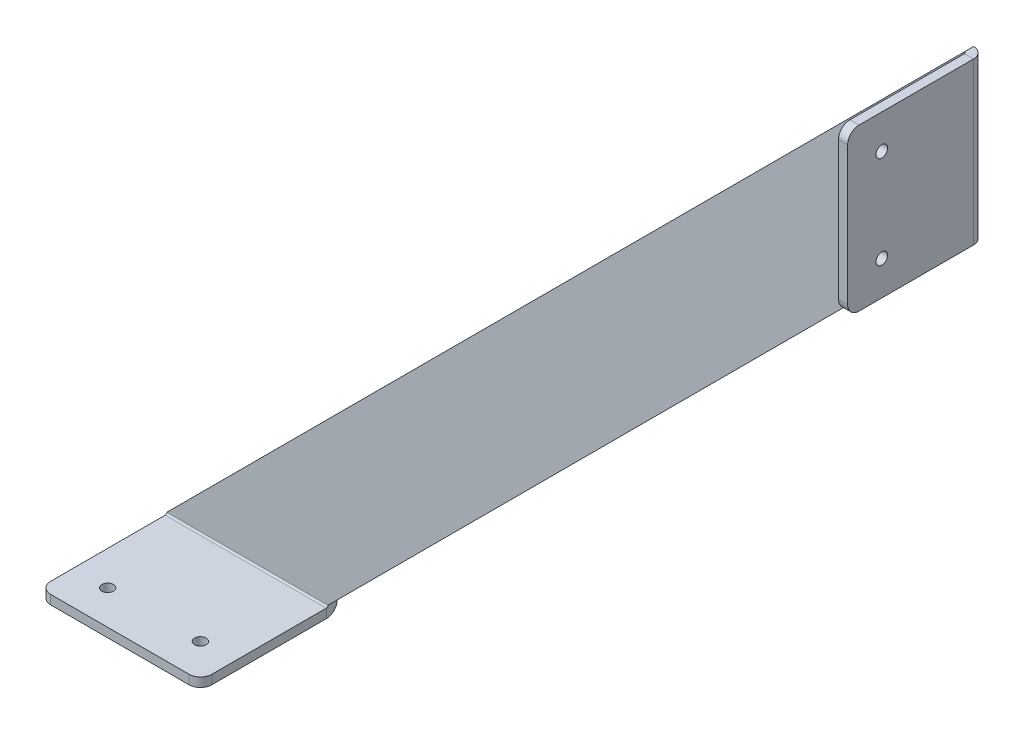
ISO-10303-21;
HEADER;
FILE_DESCRIPTION(('STEP AP214'),'2;1');
FILE_NAME('part.step','',(''),(''),'','','');
FILE_SCHEMA(('AUTOMOTIVE_DESIGN { 1 0 10303 214 1 1 1 1 }'));
ENDSEC;
DATA;
#1=APPLICATION_CONTEXT('core data for automotive mechanical design processes');
#2=APPLICATION_PROTOCOL_DEFINITION('international standard','automotive_design',2000,#1);
#3=PRODUCT_CONTEXT('',#1,'mechanical');
#4=PRODUCT('Part','Part','',(#3));
#5=PRODUCT_RELATED_PRODUCT_CATEGORY('part','',(#4));
#6=PRODUCT_DEFINITION_FORMATION('','',#4);
#7=PRODUCT_DEFINITION_CONTEXT('part definition',#1,'design');
#8=PRODUCT_DEFINITION('design','',#6,#7);
#9=PRODUCT_DEFINITION_SHAPE('','',#8);
#10=(LENGTH_UNIT() NAMED_UNIT(*) SI_UNIT(.MILLI.,.METRE.));
#11=(NAMED_UNIT(*) PLANE_ANGLE_UNIT() SI_UNIT($,.RADIAN.));
#12=(NAMED_UNIT(*) SI_UNIT($,.STERADIAN.) SOLID_ANGLE_UNIT());
#13=UNCERTAINTY_MEASURE_WITH_UNIT(LENGTH_MEASURE(1.E-05),#10,'distance_accuracy_value','');
#14=(GEOMETRIC_REPRESENTATION_CONTEXT(3) GLOBAL_UNCERTAINTY_ASSIGNED_CONTEXT((#13)) GLOBAL_UNIT_ASSIGNED_CONTEXT((#10,
#11,#12)) REPRESENTATION_CONTEXT('',''));
#15=CARTESIAN_POINT('',(0.,0.,0.));
#16=DIRECTION('',(0.,0.,1.));
#17=DIRECTION('',(1.,0.,0.));
#18=AXIS2_PLACEMENT_3D('',#15,#16,#17);
#19=CARTESIAN_POINT('',(-104.289321881345,-175.,-4.));
#20=DIRECTION('',(0.707106781186548,-0.707106781186547,0.));
#21=DIRECTION('',(0.707106781186547,0.707106781186548,0.));
#22=AXIS2_PLACEMENT_3D('',#19,#20,#21);
#23=PLANE('',#22);
#24=DIRECTION('',(0.707106781186547,0.707106781186548,0.));
#25=VECTOR('',#24,1.);
#26=CARTESIAN_POINT('',(-104.289321881345,-175.,0.));
#27=LINE('',#26,#25);
#28=CARTESIAN_POINT('',(-104.289321881345,-175.,0.));
#29=VERTEX_POINT('',#28);
#30=CARTESIAN_POINT('',(175.,104.289321881345,0.));
#31=VERTEX_POINT('',#30);
#32=EDGE_CURVE('E288',#29,#31,#27,.T.);
#33=ORIENTED_EDGE('',*,*,#32,.F.);
#34=DIRECTION('',(0.,0.,1.));
#35=VECTOR('',#34,1.);
#36=CARTESIAN_POINT('',(-104.289321881345,-175.,-4.));
#37=LINE('',#36,#35);
#38=CARTESIAN_POINT('',(-104.289321881345,-175.,-4.));
#39=VERTEX_POINT('',#38);
#40=EDGE_CURVE('E308',#39,#29,#37,.T.);
#41=ORIENTED_EDGE('',*,*,#40,.F.);
#42=DIRECTION('',(0.707106781186547,0.707106781186548,0.));
#43=VECTOR('',#42,1.);
#44=CARTESIAN_POINT('',(-104.289321881345,-175.,-4.));
#45=LINE('',#44,#43);
#46=CARTESIAN_POINT('',(175.,104.289321881345,-4.));
#47=VERTEX_POINT('',#46);
#48=EDGE_CURVE('E292',#39,#47,#45,.T.);
#49=ORIENTED_EDGE('',*,*,#48,.T.);
#50=DIRECTION('',(0.,0.,1.));
#51=VECTOR('',#50,1.);
#52=CARTESIAN_POINT('',(175.,104.289321881345,-4.));
#53=LINE('',#52,#51);
#54=EDGE_CURVE('E305',#47,#31,#53,.T.);
#55=ORIENTED_EDGE('',*,*,#54,.T.);
#56=EDGE_LOOP('',(#33,#41,#49,#55));
#57=FACE_BOUND('',#56,.T.);
#58=ADVANCED_FACE('F77',(#57),#23,.T.);
#59=CARTESIAN_POINT('',(175.,175.,-4.));
#60=DIRECTION('',(-0.707106781186547,0.707106781186547,0.));
#61=DIRECTION('',(-0.707106781186548,-0.707106781186548,0.));
#62=AXIS2_PLACEMENT_3D('',#59,#60,#61);
#63=PLANE('',#62);
#64=DIRECTION('',(-0.707106781186548,-0.707106781186548,0.));
#65=VECTOR('',#64,1.);
#66=CARTESIAN_POINT('',(175.,175.,0.));
#67=LINE('',#66,#65);
#68=CARTESIAN_POINT('',(175.,175.,0.));
#69=VERTEX_POINT('',#68);
#70=CARTESIAN_POINT('',(-175.,-175.,0.));
#71=VERTEX_POINT('',#70);
#72=EDGE_CURVE('E298',#69,#71,#67,.T.);
#73=ORIENTED_EDGE('',*,*,#72,.F.);
#74=DIRECTION('',(0.,0.,1.));
#75=VECTOR('',#74,1.);
#76=CARTESIAN_POINT('',(175.,175.,-4.));
#77=LINE('',#76,#75);
#78=CARTESIAN_POINT('',(175.,175.,-4.));
#79=VERTEX_POINT('',#78);
#80=EDGE_CURVE('E295',#79,#69,#77,.T.);
#81=ORIENTED_EDGE('',*,*,#80,.F.);
#82=DIRECTION('',(-0.707106781186548,-0.707106781186548,0.));
#83=VECTOR('',#82,1.);
#84=CARTESIAN_POINT('',(175.,175.,-4.));
#85=LINE('',#84,#83);
#86=CARTESIAN_POINT('',(-175.,-175.,-4.));
#87=VERTEX_POINT('',#86);
#88=EDGE_CURVE('E287',#79,#87,#85,.T.);
#89=ORIENTED_EDGE('',*,*,#88,.T.);
#90=DIRECTION('',(0.,0.,1.));
#91=VECTOR('',#90,1.);
#92=CARTESIAN_POINT('',(-175.,-175.,-4.));
#93=LINE('',#92,#91);
#94=EDGE_CURVE('E310',#87,#71,#93,.T.);
#95=ORIENTED_EDGE('',*,*,#94,.T.);
#96=EDGE_LOOP('',(#73,#81,#89,#95));
#97=FACE_BOUND('',#96,.T.);
#98=ADVANCED_FACE('F366',(#97),#63,.T.);
#99=CARTESIAN_POINT('',(0.,0.,-4.));
#100=DIRECTION('',(0.,0.,-1.));
#101=DIRECTION('',(-1.,0.,0.));
#102=AXIS2_PLACEMENT_3D('',#99,#100,#101);
#103=PLANE('',#102);
#104=DIRECTION('',(0.,1.,0.));
#105=VECTOR('',#104,1.);
#106=CARTESIAN_POINT('',(175.,104.289321881345,-4.));
#107=LINE('',#106,#105);
#108=EDGE_CURVE('E284',#47,#79,#107,.T.);
#109=ORIENTED_EDGE('',*,*,#108,.F.);
#110=ORIENTED_EDGE('',*,*,#48,.F.);
#111=DIRECTION('',(1.,0.,0.));
#112=VECTOR('',#111,1.);
#113=CARTESIAN_POINT('',(-175.,-175.,-4.));
#114=LINE('',#113,#112);
#115=EDGE_CURVE('E201',#87,#39,#114,.T.);
#116=ORIENTED_EDGE('',*,*,#115,.F.);
#117=ORIENTED_EDGE('',*,*,#88,.F.);
#118=EDGE_LOOP('',(#109,#110,#116,#117));
#119=FACE_BOUND('',#118,.T.);
#120=ADVANCED_FACE('F415',(#119),#103,.T.);
#121=CARTESIAN_POINT('',(0.,0.,0.));
#122=DIRECTION('',(0.,0.,-1.));
#123=DIRECTION('',(-1.,0.,0.));
#124=AXIS2_PLACEMENT_3D('',#121,#122,#123);
#125=PLANE('',#124);
#126=DIRECTION('',(0.,1.,0.));
#127=VECTOR('',#126,1.);
#128=CARTESIAN_POINT('',(175.,104.289321881345,0.));
#129=LINE('',#128,#127);
#130=EDGE_CURVE('E275',#31,#69,#129,.T.);
#131=ORIENTED_EDGE('',*,*,#130,.T.);
#132=ORIENTED_EDGE('',*,*,#72,.T.);
#133=DIRECTION('',(1.,0.,0.));
#134=VECTOR('',#133,1.);
#135=CARTESIAN_POINT('',(-175.,-175.,0.));
#136=LINE('',#135,#134);
#137=EDGE_CURVE('E301',#71,#29,#136,.T.);
#138=ORIENTED_EDGE('',*,*,#137,.T.);
#139=ORIENTED_EDGE('',*,*,#32,.T.);
#140=EDGE_LOOP('',(#131,#132,#138,#139));
#141=FACE_BOUND('',#140,.T.);
#142=ADVANCED_FACE('F369',(#141),#125,.F.);
#143=CARTESIAN_POINT('',(175.,104.289321881345,0.736600000000006));
#144=DIRECTION('',(0.,-1.,0.));
#145=DIRECTION('',(0.,0.,-1.));
#146=AXIS2_PLACEMENT_3D('',#143,#144,#145);
#147=PLANE('',#146);
#148=DIRECTION('',(-1.,0.,0.));
#149=VECTOR('',#148,1.);
#150=CARTESIAN_POINT('',(179.7366,104.289321881345,0.73659999999999));
#151=LINE('',#150,#149);
#152=CARTESIAN_POINT('',(175.7366,104.289321881345,0.736600000000004));
#153=VERTEX_POINT('',#152);
#154=CARTESIAN_POINT('',(179.7366,104.289321881345,0.73659999999999));
#155=VERTEX_POINT('',#154);
#156=EDGE_CURVE('E240',#153,#155,#151,.F.);
#157=ORIENTED_EDGE('',*,*,#156,.F.);
#158=CARTESIAN_POINT('',(175.,104.289321881345,0.736600000000006));
#159=DIRECTION('',(0.,1.,0.));
#160=DIRECTION('',(0.,0.,1.));
#161=AXIS2_PLACEMENT_3D('',#158,#159,#160);
#162=CIRCLE('',#161,0.736600000000004);
#163=EDGE_CURVE('E279',#31,#153,#162,.F.);
#164=ORIENTED_EDGE('',*,*,#163,.F.);
#165=ORIENTED_EDGE('',*,*,#54,.F.);
#166=CARTESIAN_POINT('',(175.,104.289321881345,0.736600000000006));
#167=DIRECTION('',(0.,1.,0.));
#168=DIRECTION('',(0.,0.,1.));
#169=AXIS2_PLACEMENT_3D('',#166,#167,#168);
#170=CIRCLE('',#169,4.7366);
#171=EDGE_CURVE('E272',#47,#155,#170,.F.);
#172=ORIENTED_EDGE('',*,*,#171,.T.);
#173=EDGE_LOOP('',(#157,#164,#165,#172));
#174=FACE_BOUND('',#173,.T.);
#175=ADVANCED_FACE('F409',(#174),#147,.T.);
#176=CARTESIAN_POINT('',(175.,175.,0.736600000000006));
#177=DIRECTION('',(0.,-1.,0.));
#178=DIRECTION('',(0.,0.,-1.));
#179=AXIS2_PLACEMENT_3D('',#176,#177,#178);
#180=PLANE('',#179);
#181=CARTESIAN_POINT('',(175.,175.,0.736600000000006));
#182=DIRECTION('',(0.,1.,0.));
#183=DIRECTION('',(0.,0.,1.));
#184=AXIS2_PLACEMENT_3D('',#181,#182,#183);
#185=CIRCLE('',#184,0.736600000000004);
#186=CARTESIAN_POINT('',(175.7366,175.,0.736600000000004));
#187=VERTEX_POINT('',#186);
#188=EDGE_CURVE('E247',#187,#69,#185,.T.);
#189=ORIENTED_EDGE('',*,*,#188,.F.);
#190=DIRECTION('',(-1.,0.,0.));
#191=VECTOR('',#190,1.);
#192=CARTESIAN_POINT('',(175.7366,175.,0.736600000000004));
#193=LINE('',#192,#191);
#194=CARTESIAN_POINT('',(179.7366,175.,0.73659999999999));
#195=VERTEX_POINT('',#194);
#196=EDGE_CURVE('E265',#187,#195,#193,.F.);
#197=ORIENTED_EDGE('',*,*,#196,.T.);
#198=CARTESIAN_POINT('',(175.,175.,0.736600000000006));
#199=DIRECTION('',(0.,1.,0.));
#200=DIRECTION('',(0.,0.,1.));
#201=AXIS2_PLACEMENT_3D('',#198,#199,#200);
#202=CIRCLE('',#201,4.7366);
#203=EDGE_CURVE('E276',#195,#79,#202,.T.);
#204=ORIENTED_EDGE('',*,*,#203,.T.);
#205=ORIENTED_EDGE('',*,*,#80,.T.);
#206=EDGE_LOOP('',(#189,#197,#204,#205));
#207=FACE_BOUND('',#206,.T.);
#208=ADVANCED_FACE('F376',(#207),#180,.F.);
#209=CARTESIAN_POINT('',(175.,175.,0.736600000000006));
#210=DIRECTION('',(0.,1.,0.));
#211=DIRECTION('',(1.,0.,0.));
#212=AXIS2_PLACEMENT_3D('',#209,#210,#211);
#213=CYLINDRICAL_SURFACE('',#212,4.7366);
#214=ORIENTED_EDGE('',*,*,#108,.T.);
#215=ORIENTED_EDGE('',*,*,#203,.F.);
#216=DIRECTION('',(0.,1.,0.));
#217=VECTOR('',#216,1.);
#218=CARTESIAN_POINT('',(179.7366,104.289321881345,0.73659999999999));
#219=LINE('',#218,#217);
#220=EDGE_CURVE('E262',#195,#155,#219,.F.);
#221=ORIENTED_EDGE('',*,*,#220,.T.);
#222=ORIENTED_EDGE('',*,*,#171,.F.);
#223=EDGE_LOOP('',(#214,#215,#221,#222));
#224=FACE_BOUND('',#223,.T.);
#225=ADVANCED_FACE('F413',(#224),#213,.T.);
#226=CARTESIAN_POINT('',(175.,175.,0.736600000000006));
#227=DIRECTION('',(0.,1.,0.));
#228=DIRECTION('',(1.,0.,0.));
#229=AXIS2_PLACEMENT_3D('',#226,#227,#228);
#230=CYLINDRICAL_SURFACE('',#229,0.736600000000004);
#231=ORIENTED_EDGE('',*,*,#130,.F.);
#232=ORIENTED_EDGE('',*,*,#163,.T.);
#233=DIRECTION('',(0.,1.,0.));
#234=VECTOR('',#233,1.);
#235=CARTESIAN_POINT('',(175.7366,104.289321881345,0.736600000000004));
#236=LINE('',#235,#234);
#237=EDGE_CURVE('E268',#153,#187,#236,.T.);
#238=ORIENTED_EDGE('',*,*,#237,.T.);
#239=ORIENTED_EDGE('',*,*,#188,.T.);
#240=EDGE_LOOP('',(#231,#232,#238,#239));
#241=FACE_BOUND('',#240,.T.);
#242=ADVANCED_FACE('F378',(#241),#230,.F.);
#243=CARTESIAN_POINT('',(179.7366,175.,56.));
#244=DIRECTION('',(0.,-1.,0.));
#245=DIRECTION('',(0.,0.,-1.));
#246=AXIS2_PLACEMENT_3D('',#243,#244,#245);
#247=PLANE('',#246);
#248=DIRECTION('',(0.,0.,-1.));
#249=VECTOR('',#248,1.);
#250=CARTESIAN_POINT('',(175.7366,175.,56.));
#251=LINE('',#250,#249);
#252=CARTESIAN_POINT('',(175.7366,175.,51.));
#253=VERTEX_POINT('',#252);
#254=EDGE_CURVE('E259',#187,#253,#251,.F.);
#255=ORIENTED_EDGE('',*,*,#254,.T.);
#256=DIRECTION('',(-1.,0.,0.));
#257=VECTOR('',#256,1.);
#258=CARTESIAN_POINT('',(179.7366,175.,51.));
#259=LINE('',#258,#257);
#260=CARTESIAN_POINT('',(179.7366,175.,51.));
#261=VERTEX_POINT('',#260);
#262=EDGE_CURVE('E329',#253,#261,#259,.F.);
#263=ORIENTED_EDGE('',*,*,#262,.T.);
#264=DIRECTION('',(0.,0.,1.));
#265=VECTOR('',#264,1.);
#266=CARTESIAN_POINT('',(179.7366,175.,-6.21119141947255E-13));
#267=LINE('',#266,#265);
#268=EDGE_CURVE('E251',#195,#261,#267,.T.);
#269=ORIENTED_EDGE('',*,*,#268,.F.);
#270=ORIENTED_EDGE('',*,*,#196,.F.);
#271=EDGE_LOOP('',(#255,#263,#269,#270));
#272=FACE_BOUND('',#271,.T.);
#273=ADVANCED_FACE('F387',(#272),#247,.F.);
#274=CARTESIAN_POINT('',(179.7366,104.289321881345,0.));
#275=DIRECTION('',(0.,1.,0.));
#276=DIRECTION('',(0.,0.,1.));
#277=AXIS2_PLACEMENT_3D('',#274,#275,#276);
#278=PLANE('',#277);
#279=DIRECTION('',(0.,0.,-1.));
#280=VECTOR('',#279,1.);
#281=CARTESIAN_POINT('',(179.7366,104.289321881345,-6.21119141947255E-13));
#282=LINE('',#281,#280);
#283=CARTESIAN_POINT('',(179.7366,104.289321881345,51.));
#284=VERTEX_POINT('',#283);
#285=EDGE_CURVE('E245',#284,#155,#282,.T.);
#286=ORIENTED_EDGE('',*,*,#285,.F.);
#287=DIRECTION('',(-1.,0.,0.));
#288=VECTOR('',#287,1.);
#289=CARTESIAN_POINT('',(179.7366,104.289321881345,51.));
#290=LINE('',#289,#288);
#291=CARTESIAN_POINT('',(175.7366,104.289321881345,51.));
#292=VERTEX_POINT('',#291);
#293=EDGE_CURVE('E307',#284,#292,#290,.T.);
#294=ORIENTED_EDGE('',*,*,#293,.T.);
#295=DIRECTION('',(0.,0.,1.));
#296=VECTOR('',#295,1.);
#297=CARTESIAN_POINT('',(175.7366,104.289321881345,0.));
#298=LINE('',#297,#296);
#299=EDGE_CURVE('E254',#292,#153,#298,.F.);
#300=ORIENTED_EDGE('',*,*,#299,.T.);
#301=ORIENTED_EDGE('',*,*,#156,.T.);
#302=EDGE_LOOP('',(#286,#294,#300,#301));
#303=FACE_BOUND('',#302,.T.);
#304=ADVANCED_FACE('F406',(#303),#278,.F.);
#305=CARTESIAN_POINT('',(179.7366,0.,-6.21119141947255E-13));
#306=DIRECTION('',(-1.,0.,0.));
#307=DIRECTION('',(0.,0.,1.));
#308=AXIS2_PLACEMENT_3D('',#305,#306,#307);
#309=PLANE('',#308);
#310=CARTESIAN_POINT('',(179.7366,119.289321881345,41.));
#311=DIRECTION('',(1.,0.,0.));
#312=DIRECTION('',(0.,0.,1.));
#313=AXIS2_PLACEMENT_3D('',#310,#311,#312);
#314=CIRCLE('',#313,2.55);
#315=CARTESIAN_POINT('',(179.7366,119.289321881345,43.55));
#316=VERTEX_POINT('',#315);
#317=EDGE_CURVE('E732',#316,#316,#314,.T.);
#318=ORIENTED_EDGE('',*,*,#317,.F.);
#319=EDGE_LOOP('',(#318));
#320=FACE_BOUND('',#319,.T.);
#321=CARTESIAN_POINT('',(179.7366,160.,41.));
#322=DIRECTION('',(1.,0.,0.));
#323=DIRECTION('',(0.,0.,-1.));
#324=AXIS2_PLACEMENT_3D('',#321,#322,#323);
#325=CIRCLE('',#324,2.55);
#326=CARTESIAN_POINT('',(179.7366,160.,38.45));
#327=VERTEX_POINT('',#326);
#328=EDGE_CURVE('E723',#327,#327,#325,.T.);
#329=ORIENTED_EDGE('',*,*,#328,.F.);
#330=EDGE_LOOP('',(#329));
#331=FACE_BOUND('',#330,.T.);
#332=DIRECTION('',(0.,-1.,0.));
#333=VECTOR('',#332,1.);
#334=CARTESIAN_POINT('',(179.7366,0.,56.));
#335=LINE('',#334,#333);
#336=CARTESIAN_POINT('',(179.7366,170.,56.));
#337=VERTEX_POINT('',#336);
#338=CARTESIAN_POINT('',(179.7366,109.289321881345,56.));
#339=VERTEX_POINT('',#338);
#340=EDGE_CURVE('E248',#337,#339,#335,.T.);
#341=ORIENTED_EDGE('',*,*,#340,.T.);
#342=CARTESIAN_POINT('',(179.7366,109.289321881345,51.));
#343=DIRECTION('',(-1.,0.,0.));
#344=DIRECTION('',(0.,0.,1.));
#345=AXIS2_PLACEMENT_3D('',#342,#343,#344);
#346=CIRCLE('',#345,5.);
#347=EDGE_CURVE('E327',#339,#284,#346,.F.);
#348=ORIENTED_EDGE('',*,*,#347,.T.);
#349=ORIENTED_EDGE('',*,*,#285,.T.);
#350=ORIENTED_EDGE('',*,*,#220,.F.);
#351=ORIENTED_EDGE('',*,*,#268,.T.);
#352=CARTESIAN_POINT('',(179.7366,170.,51.));
#353=DIRECTION('',(-1.,0.,0.));
#354=DIRECTION('',(0.,0.,1.));
#355=AXIS2_PLACEMENT_3D('',#352,#353,#354);
#356=CIRCLE('',#355,5.);
#357=EDGE_CURVE('E325',#261,#337,#356,.F.);
#358=ORIENTED_EDGE('',*,*,#357,.T.);
#359=EDGE_LOOP('',(#341,#348,#349,#350,#351,#358));
#360=FACE_BOUND('',#359,.T.);
#361=ADVANCED_FACE('F395',(#320,#331,#360),#309,.F.);
#362=CARTESIAN_POINT('',(175.7366,0.,-6.07153216591883E-13));
#363=DIRECTION('',(-1.,0.,0.));
#364=DIRECTION('',(0.,0.,1.));
#365=AXIS2_PLACEMENT_3D('',#362,#363,#364);
#366=PLANE('',#365);
#367=CARTESIAN_POINT('',(175.7366,119.289321881345,41.));
#368=DIRECTION('',(-1.,0.,0.));
#369=DIRECTION('',(0.,0.,1.));
#370=AXIS2_PLACEMENT_3D('',#367,#368,#369);
#371=CIRCLE('',#370,2.55);
#372=CARTESIAN_POINT('',(175.7366,119.289321881345,43.55));
#373=VERTEX_POINT('',#372);
#374=EDGE_CURVE('E727',#373,#373,#371,.F.);
#375=ORIENTED_EDGE('',*,*,#374,.T.);
#376=EDGE_LOOP('',(#375));
#377=FACE_BOUND('',#376,.T.);
#378=CARTESIAN_POINT('',(175.7366,160.,41.));
#379=DIRECTION('',(-1.,0.,0.));
#380=DIRECTION('',(0.,0.,1.));
#381=AXIS2_PLACEMENT_3D('',#378,#379,#380);
#382=CIRCLE('',#381,2.55);
#383=CARTESIAN_POINT('',(175.7366,160.,43.55));
#384=VERTEX_POINT('',#383);
#385=EDGE_CURVE('E239',#384,#384,#382,.F.);
#386=ORIENTED_EDGE('',*,*,#385,.T.);
#387=EDGE_LOOP('',(#386));
#388=FACE_BOUND('',#387,.T.);
#389=ORIENTED_EDGE('',*,*,#299,.F.);
#390=CARTESIAN_POINT('',(175.7366,109.289321881345,51.));
#391=DIRECTION('',(-1.,0.,0.));
#392=DIRECTION('',(0.,0.,1.));
#393=AXIS2_PLACEMENT_3D('',#390,#391,#392);
#394=CIRCLE('',#393,5.);
#395=CARTESIAN_POINT('',(175.7366,109.289321881345,56.));
#396=VERTEX_POINT('',#395);
#397=EDGE_CURVE('E318',#292,#396,#394,.T.);
#398=ORIENTED_EDGE('',*,*,#397,.T.);
#399=DIRECTION('',(0.,1.,0.));
#400=VECTOR('',#399,1.);
#401=CARTESIAN_POINT('',(175.7366,104.289321881345,56.));
#402=LINE('',#401,#400);
#403=CARTESIAN_POINT('',(175.7366,170.,56.));
#404=VERTEX_POINT('',#403);
#405=EDGE_CURVE('E256',#404,#396,#402,.F.);
#406=ORIENTED_EDGE('',*,*,#405,.F.);
#407=CARTESIAN_POINT('',(175.7366,170.,51.));
#408=DIRECTION('',(-1.,0.,0.));
#409=DIRECTION('',(0.,0.,1.));
#410=AXIS2_PLACEMENT_3D('',#407,#408,#409);
#411=CIRCLE('',#410,5.);
#412=EDGE_CURVE('E316',#404,#253,#411,.T.);
#413=ORIENTED_EDGE('',*,*,#412,.T.);
#414=ORIENTED_EDGE('',*,*,#254,.F.);
#415=ORIENTED_EDGE('',*,*,#237,.F.);
#416=EDGE_LOOP('',(#389,#398,#406,#413,#414,#415));
#417=FACE_BOUND('',#416,.T.);
#418=ADVANCED_FACE('F383',(#377,#388,#417),#366,.T.);
#419=CARTESIAN_POINT('',(179.7366,104.289321881345,56.));
#420=DIRECTION('',(0.,0.,-1.));
#421=DIRECTION('',(-1.,0.,0.));
#422=AXIS2_PLACEMENT_3D('',#419,#420,#421);
#423=PLANE('',#422);
#424=ORIENTED_EDGE('',*,*,#405,.T.);
#425=DIRECTION('',(-1.,0.,0.));
#426=VECTOR('',#425,1.);
#427=CARTESIAN_POINT('',(179.7366,109.289321881345,56.));
#428=LINE('',#427,#426);
#429=EDGE_CURVE('E323',#396,#339,#428,.F.);
#430=ORIENTED_EDGE('',*,*,#429,.T.);
#431=ORIENTED_EDGE('',*,*,#340,.F.);
#432=DIRECTION('',(-1.,0.,0.));
#433=VECTOR('',#432,1.);
#434=CARTESIAN_POINT('',(179.7366,170.,56.));
#435=LINE('',#434,#433);
#436=EDGE_CURVE('E320',#337,#404,#435,.T.);
#437=ORIENTED_EDGE('',*,*,#436,.T.);
#438=EDGE_LOOP('',(#424,#430,#431,#437));
#439=FACE_BOUND('',#438,.T.);
#440=ADVANCED_FACE('F399',(#439),#423,.F.);
#441=CARTESIAN_POINT('',(-175.,-175.,0.736600000000006));
#442=DIRECTION('',(-1.,0.,0.));
#443=DIRECTION('',(0.,0.,1.));
#444=AXIS2_PLACEMENT_3D('',#441,#442,#443);
#445=PLANE('',#444);
#446=DIRECTION('',(0.,1.,0.));
#447=VECTOR('',#446,1.);
#448=CARTESIAN_POINT('',(-175.,-179.7366,0.73659999999999));
#449=LINE('',#448,#447);
#450=CARTESIAN_POINT('',(-175.,-175.7366,0.736600000000004));
#451=VERTEX_POINT('',#450);
#452=CARTESIAN_POINT('',(-175.,-179.7366,0.73659999999999));
#453=VERTEX_POINT('',#452);
#454=EDGE_CURVE('E236',#451,#453,#449,.F.);
#455=ORIENTED_EDGE('',*,*,#454,.F.);
#456=CARTESIAN_POINT('',(-175.,-175.,0.736600000000006));
#457=DIRECTION('',(1.,0.,0.));
#458=DIRECTION('',(0.,0.,-1.));
#459=AXIS2_PLACEMENT_3D('',#456,#457,#458);
#460=CIRCLE('',#459,0.736600000000004);
#461=EDGE_CURVE('E205',#71,#451,#460,.F.);
#462=ORIENTED_EDGE('',*,*,#461,.F.);
#463=ORIENTED_EDGE('',*,*,#94,.F.);
#464=CARTESIAN_POINT('',(-175.,-175.,0.736600000000006));
#465=DIRECTION('',(1.,0.,0.));
#466=DIRECTION('',(0.,0.,-1.));
#467=AXIS2_PLACEMENT_3D('',#464,#465,#466);
#468=CIRCLE('',#467,4.7366);
#469=EDGE_CURVE('E204',#87,#453,#468,.F.);
#470=ORIENTED_EDGE('',*,*,#469,.T.);
#471=EDGE_LOOP('',(#455,#462,#463,#470));
#472=FACE_BOUND('',#471,.T.);
#473=ADVANCED_FACE('F364',(#472),#445,.T.);
#474=CARTESIAN_POINT('',(-104.289321881345,-175.,0.736600000000006));
#475=DIRECTION('',(-1.,0.,0.));
#476=DIRECTION('',(0.,0.,1.));
#477=AXIS2_PLACEMENT_3D('',#474,#475,#476);
#478=PLANE('',#477);
#479=CARTESIAN_POINT('',(-104.289321881345,-175.,0.736600000000006));
#480=DIRECTION('',(1.,0.,0.));
#481=DIRECTION('',(0.,0.,-1.));
#482=AXIS2_PLACEMENT_3D('',#479,#480,#481);
#483=CIRCLE('',#482,0.736600000000004);
#484=CARTESIAN_POINT('',(-104.289321881345,-175.7366,0.736600000000004));
#485=VERTEX_POINT('',#484);
#486=EDGE_CURVE('E212',#485,#29,#483,.T.);
#487=ORIENTED_EDGE('',*,*,#486,.F.);
#488=DIRECTION('',(0.,1.,0.));
#489=VECTOR('',#488,1.);
#490=CARTESIAN_POINT('',(-104.289321881345,-175.7366,0.736600000000004));
#491=LINE('',#490,#489);
#492=CARTESIAN_POINT('',(-104.289321881345,-179.7366,0.73659999999999));
#493=VERTEX_POINT('',#492);
#494=EDGE_CURVE('E209',#485,#493,#491,.F.);
#495=ORIENTED_EDGE('',*,*,#494,.T.);
#496=CARTESIAN_POINT('',(-104.289321881345,-175.,0.736600000000006));
#497=DIRECTION('',(1.,0.,0.));
#498=DIRECTION('',(0.,0.,-1.));
#499=AXIS2_PLACEMENT_3D('',#496,#497,#498);
#500=CIRCLE('',#499,4.7366);
#501=EDGE_CURVE('E194',#493,#39,#500,.T.);
#502=ORIENTED_EDGE('',*,*,#501,.T.);
#503=ORIENTED_EDGE('',*,*,#40,.T.);
#504=EDGE_LOOP('',(#487,#495,#502,#503));
#505=FACE_BOUND('',#504,.T.);
#506=ADVANCED_FACE('F210',(#505),#478,.F.);
#507=CARTESIAN_POINT('',(-104.289321881345,-175.,0.736600000000006));
#508=DIRECTION('',(1.,0.,0.));
#509=DIRECTION('',(0.,-1.,0.));
#510=AXIS2_PLACEMENT_3D('',#507,#508,#509);
#511=CYLINDRICAL_SURFACE('',#510,4.7366);
#512=ORIENTED_EDGE('',*,*,#115,.T.);
#513=ORIENTED_EDGE('',*,*,#501,.F.);
#514=DIRECTION('',(1.,0.,0.));
#515=VECTOR('',#514,1.);
#516=CARTESIAN_POINT('',(-175.,-179.7366,0.73659999999999));
#517=LINE('',#516,#515);
#518=EDGE_CURVE('E199',#493,#453,#517,.F.);
#519=ORIENTED_EDGE('',*,*,#518,.T.);
#520=ORIENTED_EDGE('',*,*,#469,.F.);
#521=EDGE_LOOP('',(#512,#513,#519,#520));
#522=FACE_BOUND('',#521,.T.);
#523=ADVANCED_FACE('F196',(#522),#511,.T.);
#524=CARTESIAN_POINT('',(-104.289321881345,-175.,0.736600000000006));
#525=DIRECTION('',(1.,0.,0.));
#526=DIRECTION('',(0.,-1.,0.));
#527=AXIS2_PLACEMENT_3D('',#524,#525,#526);
#528=CYLINDRICAL_SURFACE('',#527,0.736600000000004);
#529=ORIENTED_EDGE('',*,*,#137,.F.);
#530=ORIENTED_EDGE('',*,*,#461,.T.);
#531=DIRECTION('',(1.,0.,0.));
#532=VECTOR('',#531,1.);
#533=CARTESIAN_POINT('',(-175.,-175.7366,0.736600000000004));
#534=LINE('',#533,#532);
#535=EDGE_CURVE('E214',#451,#485,#534,.T.);
#536=ORIENTED_EDGE('',*,*,#535,.T.);
#537=ORIENTED_EDGE('',*,*,#486,.T.);
#538=EDGE_LOOP('',(#529,#530,#536,#537));
#539=FACE_BOUND('',#538,.T.);
#540=ADVANCED_FACE('F360',(#539),#528,.F.);
#541=CARTESIAN_POINT('',(-175.,-179.7366,0.));
#542=DIRECTION('',(1.,0.,0.));
#543=DIRECTION('',(0.,0.,-1.));
#544=AXIS2_PLACEMENT_3D('',#541,#542,#543);
#545=PLANE('',#544);
#546=DIRECTION('',(0.,0.,-1.));
#547=VECTOR('',#546,1.);
#548=CARTESIAN_POINT('',(-175.,-179.7366,-6.21119141947255E-13));
#549=LINE('',#548,#547);
#550=CARTESIAN_POINT('',(-175.,-179.7366,51.));
#551=VERTEX_POINT('',#550);
#552=EDGE_CURVE('E219',#551,#453,#549,.T.);
#553=ORIENTED_EDGE('',*,*,#552,.F.);
#554=DIRECTION('',(0.,1.,0.));
#555=VECTOR('',#554,1.);
#556=CARTESIAN_POINT('',(-175.,-179.7366,51.));
#557=LINE('',#556,#555);
#558=CARTESIAN_POINT('',(-175.,-175.7366,51.));
#559=VERTEX_POINT('',#558);
#560=EDGE_CURVE('E13',#551,#559,#557,.T.);
#561=ORIENTED_EDGE('',*,*,#560,.T.);
#562=DIRECTION('',(0.,0.,1.));
#563=VECTOR('',#562,1.);
#564=CARTESIAN_POINT('',(-175.,-175.7366,0.));
#565=LINE('',#564,#563);
#566=EDGE_CURVE('E220',#559,#451,#565,.F.);
#567=ORIENTED_EDGE('',*,*,#566,.T.);
#568=ORIENTED_EDGE('',*,*,#454,.T.);
#569=EDGE_LOOP('',(#553,#561,#567,#568));
#570=FACE_BOUND('',#569,.T.);
#571=ADVANCED_FACE('F356',(#570),#545,.F.);
#572=CARTESIAN_POINT('',(-104.289321881345,-179.7366,56.));
#573=DIRECTION('',(-1.,0.,0.));
#574=DIRECTION('',(0.,0.,1.));
#575=AXIS2_PLACEMENT_3D('',#572,#573,#574);
#576=PLANE('',#575);
#577=DIRECTION('',(0.,0.,-1.));
#578=VECTOR('',#577,1.);
#579=CARTESIAN_POINT('',(-104.289321881345,-175.7366,56.));
#580=LINE('',#579,#578);
#581=CARTESIAN_POINT('',(-104.289321881345,-175.7366,51.));
#582=VERTEX_POINT('',#581);
#583=EDGE_CURVE('E232',#485,#582,#580,.F.);
#584=ORIENTED_EDGE('',*,*,#583,.T.);
#585=DIRECTION('',(0.,1.,0.));
#586=VECTOR('',#585,1.);
#587=CARTESIAN_POINT('',(-104.289321881345,-179.7366,51.));
#588=LINE('',#587,#586);
#589=CARTESIAN_POINT('',(-104.289321881345,-179.7366,51.));
#590=VERTEX_POINT('',#589);
#591=EDGE_CURVE('E100',#582,#590,#588,.F.);
#592=ORIENTED_EDGE('',*,*,#591,.T.);
#593=DIRECTION('',(0.,0.,1.));
#594=VECTOR('',#593,1.);
#595=CARTESIAN_POINT('',(-104.289321881345,-179.7366,-6.21119141947255E-13));
#596=LINE('',#595,#594);
#597=EDGE_CURVE('E217',#493,#590,#596,.T.);
#598=ORIENTED_EDGE('',*,*,#597,.F.);
#599=ORIENTED_EDGE('',*,*,#494,.F.);
#600=EDGE_LOOP('',(#584,#592,#598,#599));
#601=FACE_BOUND('',#600,.T.);
#602=ADVANCED_FACE('F222',(#601),#576,.F.);
#603=CARTESIAN_POINT('',(0.,-179.7366,-6.21119141947255E-13));
#604=DIRECTION('',(0.,1.,0.));
#605=DIRECTION('',(0.,0.,1.));
#606=AXIS2_PLACEMENT_3D('',#603,#604,#605);
#607=PLANE('',#606);
#608=CARTESIAN_POINT('',(-160.,-179.7366,41.));
#609=DIRECTION('',(0.,-1.,0.));
#610=DIRECTION('',(0.,0.,1.));
#611=AXIS2_PLACEMENT_3D('',#608,#609,#610);
#612=CIRCLE('',#611,2.54999999999999);
#613=CARTESIAN_POINT('',(-160.,-179.7366,43.55));
#614=VERTEX_POINT('',#613);
#615=EDGE_CURVE('E744',#614,#614,#612,.T.);
#616=ORIENTED_EDGE('',*,*,#615,.F.);
#617=EDGE_LOOP('',(#616));
#618=FACE_BOUND('',#617,.T.);
#619=CARTESIAN_POINT('',(-119.289321881345,-179.7366,41.));
#620=DIRECTION('',(0.,-1.,0.));
#621=DIRECTION('',(0.,0.,-1.));
#622=AXIS2_PLACEMENT_3D('',#619,#620,#621);
#623=CIRCLE('',#622,2.54999999999999);
#624=CARTESIAN_POINT('',(-119.289321881345,-179.7366,38.45));
#625=VERTEX_POINT('',#624);
#626=EDGE_CURVE('E738',#625,#625,#623,.T.);
#627=ORIENTED_EDGE('',*,*,#626,.F.);
#628=EDGE_LOOP('',(#627));
#629=FACE_BOUND('',#628,.T.);
#630=ORIENTED_EDGE('',*,*,#597,.T.);
#631=CARTESIAN_POINT('',(-109.289321881345,-179.7366,51.));
#632=DIRECTION('',(0.,1.,0.));
#633=DIRECTION('',(0.,0.,1.));
#634=AXIS2_PLACEMENT_3D('',#631,#632,#633);
#635=CIRCLE('',#634,5.);
#636=CARTESIAN_POINT('',(-109.289321881345,-179.7366,56.));
#637=VERTEX_POINT('',#636);
#638=EDGE_CURVE('E85',#590,#637,#635,.F.);
#639=ORIENTED_EDGE('',*,*,#638,.T.);
#640=DIRECTION('',(-1.,0.,0.));
#641=VECTOR('',#640,1.);
#642=CARTESIAN_POINT('',(0.,-179.7366,56.));
#643=LINE('',#642,#641);
#644=CARTESIAN_POINT('',(-170.,-179.7366,56.));
#645=VERTEX_POINT('',#644);
#646=EDGE_CURVE('E223',#637,#645,#643,.T.);
#647=ORIENTED_EDGE('',*,*,#646,.T.);
#648=CARTESIAN_POINT('',(-170.,-179.7366,51.));
#649=DIRECTION('',(0.,1.,0.));
#650=DIRECTION('',(0.,0.,1.));
#651=AXIS2_PLACEMENT_3D('',#648,#649,#650);
#652=CIRCLE('',#651,5.);
#653=EDGE_CURVE('E92',#645,#551,#652,.F.);
#654=ORIENTED_EDGE('',*,*,#653,.T.);
#655=ORIENTED_EDGE('',*,*,#552,.T.);
#656=ORIENTED_EDGE('',*,*,#518,.F.);
#657=EDGE_LOOP('',(#630,#639,#647,#654,#655,#656));
#658=FACE_BOUND('',#657,.T.);
#659=ADVANCED_FACE('F216',(#618,#629,#658),#607,.F.);
#660=CARTESIAN_POINT('',(0.,-175.7366,-6.07153216591883E-13));
#661=DIRECTION('',(0.,1.,0.));
#662=DIRECTION('',(0.,0.,1.));
#663=AXIS2_PLACEMENT_3D('',#660,#661,#662);
#664=PLANE('',#663);
#665=CARTESIAN_POINT('',(-160.,-175.7366,41.));
#666=DIRECTION('',(0.,1.,0.));
#667=DIRECTION('',(0.,0.,1.));
#668=AXIS2_PLACEMENT_3D('',#665,#666,#667);
#669=CIRCLE('',#668,2.54999999999999);
#670=CARTESIAN_POINT('',(-160.,-175.7366,43.55));
#671=VERTEX_POINT('',#670);
#672=EDGE_CURVE('E741',#671,#671,#669,.F.);
#673=ORIENTED_EDGE('',*,*,#672,.T.);
#674=EDGE_LOOP('',(#673));
#675=FACE_BOUND('',#674,.T.);
#676=CARTESIAN_POINT('',(-119.289321881345,-175.7366,41.));
#677=DIRECTION('',(0.,1.,0.));
#678=DIRECTION('',(0.,0.,1.));
#679=AXIS2_PLACEMENT_3D('',#676,#677,#678);
#680=CIRCLE('',#679,2.54999999999999);
#681=CARTESIAN_POINT('',(-119.289321881345,-175.7366,43.55));
#682=VERTEX_POINT('',#681);
#683=EDGE_CURVE('E735',#682,#682,#680,.F.);
#684=ORIENTED_EDGE('',*,*,#683,.T.);
#685=EDGE_LOOP('',(#684));
#686=FACE_BOUND('',#685,.T.);
#687=DIRECTION('',(1.,0.,0.));
#688=VECTOR('',#687,1.);
#689=CARTESIAN_POINT('',(-175.,-175.7366,56.));
#690=LINE('',#689,#688);
#691=CARTESIAN_POINT('',(-109.289321881345,-175.7366,56.));
#692=VERTEX_POINT('',#691);
#693=CARTESIAN_POINT('',(-170.,-175.7366,56.));
#694=VERTEX_POINT('',#693);
#695=EDGE_CURVE('E226',#692,#694,#690,.F.);
#696=ORIENTED_EDGE('',*,*,#695,.F.);
#697=CARTESIAN_POINT('',(-109.289321881345,-175.7366,51.));
#698=DIRECTION('',(0.,1.,0.));
#699=DIRECTION('',(0.,0.,1.));
#700=AXIS2_PLACEMENT_3D('',#697,#698,#699);
#701=CIRCLE('',#700,5.);
#702=EDGE_CURVE('E338',#692,#582,#701,.T.);
#703=ORIENTED_EDGE('',*,*,#702,.T.);
#704=ORIENTED_EDGE('',*,*,#583,.F.);
#705=ORIENTED_EDGE('',*,*,#535,.F.);
#706=ORIENTED_EDGE('',*,*,#566,.F.);
#707=CARTESIAN_POINT('',(-170.,-175.7366,51.));
#708=DIRECTION('',(0.,1.,0.));
#709=DIRECTION('',(0.,0.,1.));
#710=AXIS2_PLACEMENT_3D('',#707,#708,#709);
#711=CIRCLE('',#710,5.);
#712=EDGE_CURVE('E336',#559,#694,#711,.T.);
#713=ORIENTED_EDGE('',*,*,#712,.T.);
#714=EDGE_LOOP('',(#696,#703,#704,#705,#706,#713));
#715=FACE_BOUND('',#714,.T.);
#716=ADVANCED_FACE('F350',(#675,#686,#715),#664,.T.);
#717=CARTESIAN_POINT('',(-175.,-179.7366,56.));
#718=DIRECTION('',(0.,0.,-1.));
#719=DIRECTION('',(0.,1.,0.));
#720=AXIS2_PLACEMENT_3D('',#717,#718,#719);
#721=PLANE('',#720);
#722=ORIENTED_EDGE('',*,*,#646,.F.);
#723=DIRECTION('',(0.,1.,0.));
#724=VECTOR('',#723,1.);
#725=CARTESIAN_POINT('',(-109.289321881345,-179.7366,56.));
#726=LINE('',#725,#724);
#727=EDGE_CURVE('E333',#637,#692,#726,.T.);
#728=ORIENTED_EDGE('',*,*,#727,.T.);
#729=ORIENTED_EDGE('',*,*,#695,.T.);
#730=DIRECTION('',(0.,1.,0.));
#731=VECTOR('',#730,1.);
#732=CARTESIAN_POINT('',(-170.,-179.7366,56.));
#733=LINE('',#732,#731);
#734=EDGE_CURVE('E331',#694,#645,#733,.F.);
#735=ORIENTED_EDGE('',*,*,#734,.T.);
#736=EDGE_LOOP('',(#722,#728,#729,#735));
#737=FACE_BOUND('',#736,.T.);
#738=ADVANCED_FACE('F345',(#737),#721,.F.);
#739=CARTESIAN_POINT('',(168.524110831897,160.,41.));
#740=DIRECTION('',(1.,0.,0.));
#741=DIRECTION('',(0.,0.,-1.));
#742=AXIS2_PLACEMENT_3D('',#739,#740,#741);
#743=CYLINDRICAL_SURFACE('',#742,2.55);
#744=ORIENTED_EDGE('',*,*,#328,.T.);
#745=EDGE_LOOP('',(#744));
#746=FACE_BOUND('',#745,.T.);
#747=ORIENTED_EDGE('',*,*,#385,.F.);
#748=EDGE_LOOP('',(#747));
#749=FACE_BOUND('',#748,.T.);
#750=ADVANCED_FACE('F464',(#746,#749),#743,.F.);
#751=CARTESIAN_POINT('',(168.524110831897,119.289321881345,41.));
#752=DIRECTION('',(1.,0.,0.));
#753=DIRECTION('',(0.,0.,-1.));
#754=AXIS2_PLACEMENT_3D('',#751,#752,#753);
#755=CYLINDRICAL_SURFACE('',#754,2.55);
#756=ORIENTED_EDGE('',*,*,#317,.T.);
#757=EDGE_LOOP('',(#756));
#758=FACE_BOUND('',#757,.T.);
#759=ORIENTED_EDGE('',*,*,#374,.F.);
#760=EDGE_LOOP('',(#759));
#761=FACE_BOUND('',#760,.T.);
#762=ADVANCED_FACE('F576',(#758,#761),#755,.F.);
#763=CARTESIAN_POINT('',(-119.289321881345,-168.524110831897,41.));
#764=DIRECTION('',(0.,-1.,0.));
#765=DIRECTION('',(0.,0.,-1.));
#766=AXIS2_PLACEMENT_3D('',#763,#764,#765);
#767=CYLINDRICAL_SURFACE('',#766,2.54999999999999);
#768=ORIENTED_EDGE('',*,*,#626,.T.);
#769=EDGE_LOOP('',(#768));
#770=FACE_BOUND('',#769,.T.);
#771=ORIENTED_EDGE('',*,*,#683,.F.);
#772=EDGE_LOOP('',(#771));
#773=FACE_BOUND('',#772,.T.);
#774=ADVANCED_FACE('F565',(#770,#773),#767,.F.);
#775=CARTESIAN_POINT('',(-160.,-168.524110831897,41.));
#776=DIRECTION('',(0.,-1.,0.));
#777=DIRECTION('',(0.,0.,-1.));
#778=AXIS2_PLACEMENT_3D('',#775,#776,#777);
#779=CYLINDRICAL_SURFACE('',#778,2.54999999999999);
#780=ORIENTED_EDGE('',*,*,#615,.T.);
#781=EDGE_LOOP('',(#780));
#782=FACE_BOUND('',#781,.T.);
#783=ORIENTED_EDGE('',*,*,#672,.F.);
#784=EDGE_LOOP('',(#783));
#785=FACE_BOUND('',#784,.T.);
#786=ADVANCED_FACE('F429',(#782,#785),#779,.F.);
#787=CARTESIAN_POINT('',(179.7366,109.289321881345,51.));
#788=DIRECTION('',(-1.,0.,0.));
#789=DIRECTION('',(0.,0.,1.));
#790=AXIS2_PLACEMENT_3D('',#787,#788,#789);
#791=CYLINDRICAL_SURFACE('',#790,5.);
#792=ORIENTED_EDGE('',*,*,#347,.F.);
#793=ORIENTED_EDGE('',*,*,#429,.F.);
#794=ORIENTED_EDGE('',*,*,#397,.F.);
#795=ORIENTED_EDGE('',*,*,#293,.F.);
#796=EDGE_LOOP('',(#792,#793,#794,#795));
#797=FACE_BOUND('',#796,.T.);
#798=ADVANCED_FACE('F402',(#797),#791,.T.);
#799=CARTESIAN_POINT('',(179.7366,170.,51.));
#800=DIRECTION('',(-1.,0.,0.));
#801=DIRECTION('',(0.,0.,1.));
#802=AXIS2_PLACEMENT_3D('',#799,#800,#801);
#803=CYLINDRICAL_SURFACE('',#802,5.);
#804=ORIENTED_EDGE('',*,*,#357,.F.);
#805=ORIENTED_EDGE('',*,*,#262,.F.);
#806=ORIENTED_EDGE('',*,*,#412,.F.);
#807=ORIENTED_EDGE('',*,*,#436,.F.);
#808=EDGE_LOOP('',(#804,#805,#806,#807));
#809=FACE_BOUND('',#808,.T.);
#810=ADVANCED_FACE('F391',(#809),#803,.T.);
#811=CARTESIAN_POINT('',(-109.289321881345,-179.7366,51.));
#812=DIRECTION('',(0.,1.,0.));
#813=DIRECTION('',(0.,0.,1.));
#814=AXIS2_PLACEMENT_3D('',#811,#812,#813);
#815=CYLINDRICAL_SURFACE('',#814,5.);
#816=ORIENTED_EDGE('',*,*,#638,.F.);
#817=ORIENTED_EDGE('',*,*,#591,.F.);
#818=ORIENTED_EDGE('',*,*,#702,.F.);
#819=ORIENTED_EDGE('',*,*,#727,.F.);
#820=EDGE_LOOP('',(#816,#817,#818,#819));
#821=FACE_BOUND('',#820,.T.);
#822=ADVANCED_FACE('F348',(#821),#815,.T.);
#823=CARTESIAN_POINT('',(-170.,-179.7366,51.));
#824=DIRECTION('',(0.,1.,0.));
#825=DIRECTION('',(0.,0.,1.));
#826=AXIS2_PLACEMENT_3D('',#823,#824,#825);
#827=CYLINDRICAL_SURFACE('',#826,5.);
#828=ORIENTED_EDGE('',*,*,#653,.F.);
#829=ORIENTED_EDGE('',*,*,#734,.F.);
#830=ORIENTED_EDGE('',*,*,#712,.F.);
#831=ORIENTED_EDGE('',*,*,#560,.F.);
#832=EDGE_LOOP('',(#828,#829,#830,#831));
#833=FACE_BOUND('',#832,.T.);
#834=ADVANCED_FACE('F79',(#833),#827,.T.);
#835=CLOSED_SHELL('',(#58,#98,#120,#142,#175,#208,#225,#242,#273,#304,#361,#418,#440,#473,#506,
#523,#540,#571,#602,#659,#716,#738,#750,#762,#774,#786,#798,#810,#822,#834));
#836=MANIFOLD_SOLID_BREP('B2',#835);
#837=ADVANCED_BREP_SHAPE_REPRESENTATION('',(#18,#836),#14);
#838=SHAPE_DEFINITION_REPRESENTATION(#9,#837);
ENDSEC;
END-ISO-10303-21;
